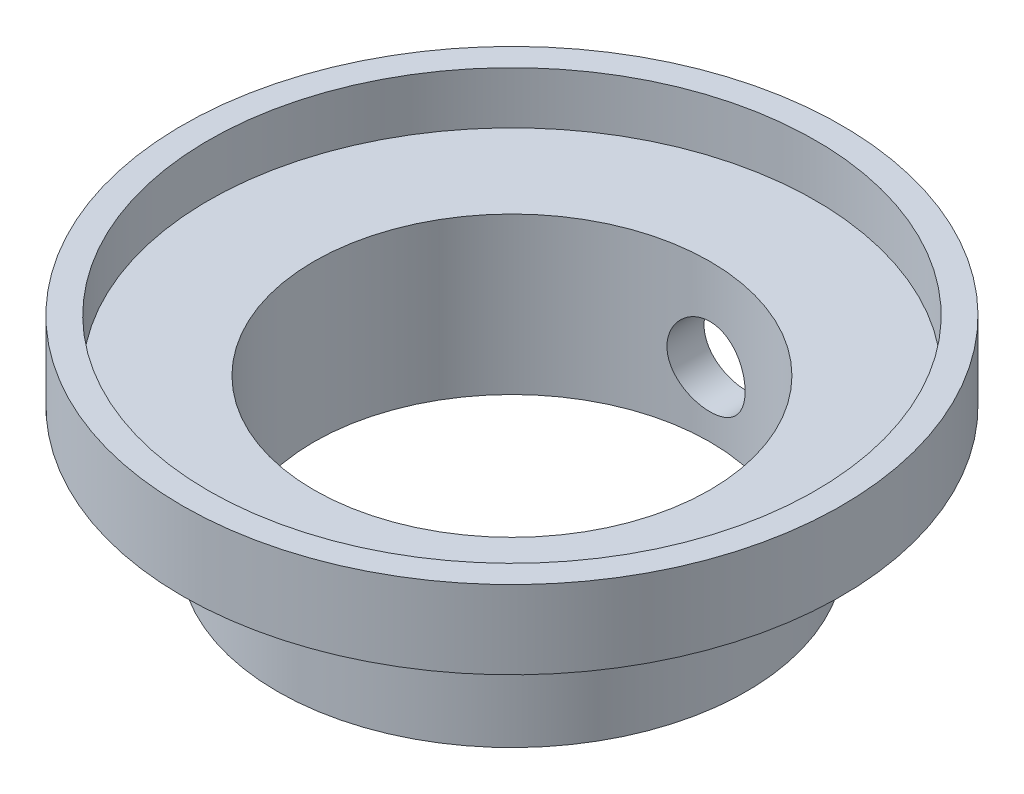
ISO-10303-21;
HEADER;
FILE_DESCRIPTION(('STEP AP214'),'2;1');
FILE_NAME('part.step','',(''),(''),'','','');
FILE_SCHEMA(('AUTOMOTIVE_DESIGN { 1 0 10303 214 1 1 1 1 }'));
ENDSEC;
DATA;
#1=APPLICATION_CONTEXT('core data for automotive mechanical design processes');
#2=APPLICATION_PROTOCOL_DEFINITION('international standard','automotive_design',2000,#1);
#3=PRODUCT_CONTEXT('',#1,'mechanical');
#4=PRODUCT('Part','Part','',(#3));
#5=PRODUCT_RELATED_PRODUCT_CATEGORY('part','',(#4));
#6=PRODUCT_DEFINITION_FORMATION('','',#4);
#7=PRODUCT_DEFINITION_CONTEXT('part definition',#1,'design');
#8=PRODUCT_DEFINITION('design','',#6,#7);
#9=PRODUCT_DEFINITION_SHAPE('','',#8);
#10=(LENGTH_UNIT() NAMED_UNIT(*) SI_UNIT(.MILLI.,.METRE.));
#11=(NAMED_UNIT(*) PLANE_ANGLE_UNIT() SI_UNIT($,.RADIAN.));
#12=(NAMED_UNIT(*) SI_UNIT($,.STERADIAN.) SOLID_ANGLE_UNIT());
#13=UNCERTAINTY_MEASURE_WITH_UNIT(LENGTH_MEASURE(1.E-05),#10,'distance_accuracy_value','');
#14=(GEOMETRIC_REPRESENTATION_CONTEXT(3) GLOBAL_UNCERTAINTY_ASSIGNED_CONTEXT((#13)) GLOBAL_UNIT_ASSIGNED_CONTEXT((#10,
#11,#12)) REPRESENTATION_CONTEXT('',''));
#15=CARTESIAN_POINT('',(0.,0.,0.));
#16=DIRECTION('',(0.,0.,1.));
#17=DIRECTION('',(1.,0.,0.));
#18=AXIS2_PLACEMENT_3D('',#15,#16,#17);
#19=CARTESIAN_POINT('',(0.,5.,0.));
#20=DIRECTION('',(0.,-1.,0.));
#21=DIRECTION('',(0.,0.,-1.));
#22=AXIS2_PLACEMENT_3D('',#19,#20,#21);
#23=CYLINDRICAL_SURFACE('',#22,7.6);
#24=CARTESIAN_POINT('',(0.,4.,-7.6));
#25=CARTESIAN_POINT('',(-0.0833882954260983,3.99999690568203,-7.59999846731646));
#26=CARTESIAN_POINT('',(-0.16681595080041,3.99302289688531,-7.59861347336578));
#27=CARTESIAN_POINT('',(-0.331314660751745,3.96533237390495,-7.59322202864026));
#28=CARTESIAN_POINT('',(-0.412383763062962,3.94460479524537,-7.58921346729257));
#29=CARTESIAN_POINT('',(-0.569763069772122,3.89007113109502,-7.57902267273425));
#30=CARTESIAN_POINT('',(-0.646077697407665,3.85627741896236,-7.57284249650143));
#31=CARTESIAN_POINT('',(-0.791948260339939,3.7766071862987,-7.55898096744683));
#32=CARTESIAN_POINT('',(-0.8615046287321,3.73073144073124,-7.55129971091522));
#33=CARTESIAN_POINT('',(-0.992808425317605,3.62755693254237,-7.53516852567));
#34=CARTESIAN_POINT('',(-1.05445373642969,3.57012945262946,-7.5267105783628));
#35=CARTESIAN_POINT('',(-1.16730148821099,3.4457583720991,-7.51003786426471));
#36=CARTESIAN_POINT('',(-1.21850312777628,3.37881404213939,-7.50182311617022));
#37=CARTESIAN_POINT('',(-1.30944262659768,3.2365777964665,-7.48648868213781));
#38=CARTESIAN_POINT('',(-1.34907514881321,3.1612173217938,-7.47937931809867));
#39=CARTESIAN_POINT('',(-1.41507667243237,3.00474353065807,-7.46717428861888));
#40=CARTESIAN_POINT('',(-1.44144694794969,2.92363076767617,-7.46207842974941));
#41=CARTESIAN_POINT('',(-1.47984472334415,2.7590522880349,-7.45455842094374));
#42=CARTESIAN_POINT('',(-1.49205115821018,2.6756298711449,-7.45210096977427));
#43=CARTESIAN_POINT('',(-1.5023304619897,2.50788773805616,-7.45003574737171));
#44=CARTESIAN_POINT('',(-1.50040473755417,2.42356811199577,-7.45042769252261));
#45=CARTESIAN_POINT('',(-1.48261914878387,2.2577314501898,-7.45398670792618));
#46=CARTESIAN_POINT('',(-1.46696405066031,2.17619144823763,-7.45711299510332));
#47=CARTESIAN_POINT('',(-1.42248716134059,2.01691841453156,-7.46572425876888));
#48=CARTESIAN_POINT('',(-1.39366475621043,1.93918556047546,-7.47120934523709));
#49=CARTESIAN_POINT('',(-1.32347487518395,1.78914131772466,-7.48396207443636));
#50=CARTESIAN_POINT('',(-1.28202591053328,1.71686906854432,-7.49124123562805));
#51=CARTESIAN_POINT('',(-1.18781701987153,1.58022873241671,-7.50675449384545));
#52=CARTESIAN_POINT('',(-1.13505582659404,1.51586153231404,-7.51498869781352));
#53=CARTESIAN_POINT('',(-1.01862217733036,1.39567656188384,-7.53166115587321));
#54=CARTESIAN_POINT('',(-0.95477487380354,1.3400281888219,-7.54010045857306));
#55=CARTESIAN_POINT('',(-0.818563301546584,1.24020493896749,-7.55610011368138));
#56=CARTESIAN_POINT('',(-0.746198929005114,1.19603020204387,-7.56366045537429));
#57=CARTESIAN_POINT('',(-0.594821684292629,1.12037822561605,-7.57706818317075));
#58=CARTESIAN_POINT('',(-0.515799081363791,1.08891997383981,-7.58291300419203));
#59=CARTESIAN_POINT('',(-0.353449644093562,1.03977254458351,-7.59221159681854));
#60=CARTESIAN_POINT('',(-0.270123318512191,1.02208174355345,-7.59566565035377));
#61=CARTESIAN_POINT('',(-0.102987822670782,1.0012103476005,-7.59975438236712));
#62=CARTESIAN_POINT('',(-0.0192086768965953,0.997797870631168,-7.60043411176403));
#63=CARTESIAN_POINT('',(0.147722781639433,1.00495603921252,-7.59902259316334));
#64=CARTESIAN_POINT('',(0.230875128426194,1.01552592017214,-7.59693149668157));
#65=CARTESIAN_POINT('',(0.393447241536413,1.05015608641561,-7.59024144613246));
#66=CARTESIAN_POINT('',(0.472893263908822,1.07409774751721,-7.58566455384801));
#67=CARTESIAN_POINT('',(0.62664330092132,1.13466250233559,-7.57451418337739));
#68=CARTESIAN_POINT('',(0.700946937407159,1.17128652748556,-7.56794055854917));
#69=CARTESIAN_POINT('',(0.843283449644109,1.25668052361383,-7.55341365928545));
#70=CARTESIAN_POINT('',(0.91123067852546,1.30559054943502,-7.54544482149564));
#71=CARTESIAN_POINT('',(1.03803649090538,1.4139802141129,-7.52904878544796));
#72=CARTESIAN_POINT('',(1.09689412604163,1.47346095447399,-7.52062153948595));
#73=CARTESIAN_POINT('',(1.20474196965242,1.60235797955403,-7.5041071483421));
#74=CARTESIAN_POINT('',(1.25357318872571,1.67190832342883,-7.49602688556772));
#75=CARTESIAN_POINT('',(1.33886037156818,1.81836049667803,-7.48126553466691));
#76=CARTESIAN_POINT('',(1.37531682351243,1.89526203589999,-7.47458439135027));
#77=CARTESIAN_POINT('',(1.43460073473362,2.05385094926967,-7.46343298965883));
#78=CARTESIAN_POINT('',(1.45749786163772,2.13551144926044,-7.45895145046849));
#79=CARTESIAN_POINT('',(1.4892252543612,2.30161833644466,-7.4526823600342));
#80=CARTESIAN_POINT('',(1.49805730061784,2.38606436964802,-7.45089446781476));
#81=CARTESIAN_POINT('',(1.50133928073934,2.5537497522602,-7.45023368379837));
#82=CARTESIAN_POINT('',(1.49604034648454,2.63698408788289,-7.45130989131229));
#83=CARTESIAN_POINT('',(1.47176408075177,2.80135012442833,-7.45614250333681));
#84=CARTESIAN_POINT('',(1.45278685283432,2.88248184126553,-7.45989888755535));
#85=CARTESIAN_POINT('',(1.40180342852674,3.04018513890953,-7.46964612749199));
#86=CARTESIAN_POINT('',(1.36982725324188,3.11676676418556,-7.4756318319363));
#87=CARTESIAN_POINT('',(1.2937821421052,3.26351762291104,-7.48916636236456));
#88=CARTESIAN_POINT('',(1.24971222621703,3.33368633606495,-7.49671531501676));
#89=CARTESIAN_POINT('',(1.1498695688623,3.46687165323727,-7.51268199677539));
#90=CARTESIAN_POINT('',(1.09391516013953,3.52975061833971,-7.52111203985961));
#91=CARTESIAN_POINT('',(0.972267748268353,3.64530988408945,-7.53780187135944));
#92=CARTESIAN_POINT('',(0.906572510743165,3.69798783839216,-7.54606162021606));
#93=CARTESIAN_POINT('',(0.766507935165378,3.79215323549242,-7.5615789045873));
#94=CARTESIAN_POINT('',(0.69205736675514,3.83352174052282,-7.56882542365656));
#95=CARTESIAN_POINT('',(0.537139996315096,3.90309548912266,-7.58139153478262));
#96=CARTESIAN_POINT('',(0.456678744112609,3.93131270551537,-7.5867128785113));
#97=CARTESIAN_POINT('',(0.313353711133121,3.96826081196191,-7.59378422734988));
#98=CARTESIAN_POINT('',(0.25131073766699,3.98014197828515,-7.59610160464355));
#99=CARTESIAN_POINT('',(0.126186001843747,3.99601262315547,-7.59921004769734));
#100=CARTESIAN_POINT('',(0.0631042711274969,4.00000234163175,-7.60000115986155));
#101=CARTESIAN_POINT('',(0.,4.,-7.6));
#102=B_SPLINE_CURVE_WITH_KNOTS('',3,(#24,#25,#26,#27,#28,#29,#30,#31,#32,#33,#34,#35,#36,#37,
#38,#39,#40,#41,#42,#43,#44,#45,#46,#47,#48,#49,#50,#51,#52,#53,#54,#55,#56,#57,#58,#59,#60,#61,
#62,#63,#64,#65,#66,#67,#68,#69,#70,#71,#72,#73,#74,#75,#76,#77,#78,#79,#80,#81,#82,#83,#84,#85,
#86,#87,#88,#89,#90,#91,#92,#93,#94,#95,#96,#97,#98,#99,#100,#101),.UNSPECIFIED.,.T.,.F.,(4,2,2,
2,2,2,2,2,2,2,2,2,2,2,2,2,2,2,2,2,2,2,2,2,2,2,2,2,2,2,2,2,2,2,2,2,2,2,4),(0.,0.249934048903834,
0.500069408996305,0.74996847395227,0.999851513831067,1.2526907488705,1.50554937119113,
1.76064318277515,2.01571248262733,2.26752309162421,2.51930863687617,2.76740160495061,
3.01550614169698,3.26524708317318,3.51501601681917,3.76915752040533,4.0233021219469,
4.27782481225775,4.53231748299816,4.78266071852692,5.03299026521365,5.28113356743093,
5.52929509794908,5.78042525891372,6.0315816038554,6.28645634575638,6.54132103187538,
6.79486460227273,7.04837607514282,7.2974123682363,7.5464467758565,7.79490927605594,
8.04339191677569,8.29598831213913,8.54864273861896,8.80386010434105,9.05884466625669,
9.24798854372353,9.4371266704286),.UNSPECIFIED.);
#103=CARTESIAN_POINT('',(0.,4.,-7.6));
#104=VERTEX_POINT('',#103);
#105=EDGE_CURVE('E73',#104,#104,#102,.T.);
#106=ORIENTED_EDGE('',*,*,#105,.F.);
#107=EDGE_LOOP('',(#106));
#108=FACE_BOUND('',#107,.T.);
#109=CARTESIAN_POINT('',(0.,0.,0.));
#110=DIRECTION('',(0.,1.,0.));
#111=DIRECTION('',(0.,0.,1.));
#112=AXIS2_PLACEMENT_3D('',#109,#110,#111);
#113=CIRCLE('',#112,7.6);
#114=CARTESIAN_POINT('',(0.,0.,7.6));
#115=VERTEX_POINT('',#114);
#116=EDGE_CURVE('E55',#115,#115,#113,.T.);
#117=ORIENTED_EDGE('',*,*,#116,.F.);
#118=EDGE_LOOP('',(#117));
#119=FACE_BOUND('',#118,.T.);
#120=CARTESIAN_POINT('',(0.,6.,0.));
#121=DIRECTION('',(0.,1.,0.));
#122=DIRECTION('',(0.,0.,1.));
#123=AXIS2_PLACEMENT_3D('',#120,#121,#122);
#124=CIRCLE('',#123,7.6);
#125=CARTESIAN_POINT('',(0.,6.,7.6));
#126=VERTEX_POINT('',#125);
#127=EDGE_CURVE('E59',#126,#126,#124,.T.);
#128=ORIENTED_EDGE('',*,*,#127,.T.);
#129=EDGE_LOOP('',(#128));
#130=FACE_BOUND('',#129,.T.);
#131=ADVANCED_FACE('F37',(#108,#119,#130),#23,.F.);
#132=CARTESIAN_POINT('',(0.,0.,0.));
#133=DIRECTION('',(0.,1.,0.));
#134=DIRECTION('',(0.,0.,1.));
#135=AXIS2_PLACEMENT_3D('',#132,#133,#134);
#136=PLANE('',#135);
#137=CARTESIAN_POINT('',(0.,0.,0.));
#138=DIRECTION('',(0.,1.,0.));
#139=DIRECTION('',(0.,0.,1.));
#140=AXIS2_PLACEMENT_3D('',#137,#138,#139);
#141=CIRCLE('',#140,8.99999999999999);
#142=CARTESIAN_POINT('',(0.,0.,8.99999999999999));
#143=VERTEX_POINT('',#142);
#144=EDGE_CURVE('E50',#143,#143,#141,.T.);
#145=ORIENTED_EDGE('',*,*,#144,.F.);
#146=EDGE_LOOP('',(#145));
#147=FACE_BOUND('',#146,.T.);
#148=ORIENTED_EDGE('',*,*,#116,.T.);
#149=EDGE_LOOP('',(#148));
#150=FACE_BOUND('',#149,.T.);
#151=ADVANCED_FACE('F87',(#147,#150),#136,.F.);
#152=CARTESIAN_POINT('',(0.,5.,0.));
#153=DIRECTION('',(0.,-1.,0.));
#154=DIRECTION('',(0.,0.,-1.));
#155=AXIS2_PLACEMENT_3D('',#152,#153,#154);
#156=CYLINDRICAL_SURFACE('',#155,8.99999999999999);
#157=CARTESIAN_POINT('',(0.,4.,-8.99999999999999));
#158=CARTESIAN_POINT('',(-0.0836345429749289,3.99999664663131,-8.99999856701294));
#159=CARTESIAN_POINT('',(-0.167314729103293,3.99298163501865,-8.9988220674782));
#160=CARTESIAN_POINT('',(-0.332328133003826,3.96511860474081,-8.99424206964832));
#161=CARTESIAN_POINT('',(-0.413659120775548,3.94425786585304,-8.99083652354333));
#162=CARTESIAN_POINT('',(-0.571562848327587,3.88935073084435,-8.98218040941869));
#163=CARTESIAN_POINT('',(-0.648139421059141,3.85531512061566,-8.97693135095515));
#164=CARTESIAN_POINT('',(-0.794485105186767,3.77505262476856,-8.96516536249242));
#165=CARTESIAN_POINT('',(-0.864254993927155,3.7288271335102,-8.9586485775266));
#166=CARTESIAN_POINT('',(-0.995683568575008,3.62502694970772,-8.94499990474987));
#167=CARTESIAN_POINT('',(-1.05726774212098,3.56735853121832,-8.93786323088913));
#168=CARTESIAN_POINT('',(-1.16993309919596,3.44251121891631,-8.92381576126039));
#169=CARTESIAN_POINT('',(-1.22101361963458,3.37533172512603,-8.916904979776));
#170=CARTESIAN_POINT('',(-1.31152027536308,3.23285742028177,-8.90404539455868));
#171=CARTESIAN_POINT('',(-1.3508727317166,3.15751519791715,-8.89810277454981));
#172=CARTESIAN_POINT('',(-1.41633501924673,3.00117426141962,-8.88791873876804));
#173=CARTESIAN_POINT('',(-1.44244574493937,2.92017592979342,-8.88367720808584));
#174=CARTESIAN_POINT('',(-1.48044862667088,2.75561183508608,-8.87742322105653));
#175=CARTESIAN_POINT('',(-1.49246941748124,2.67207655809917,-8.87539061091419));
#176=CARTESIAN_POINT('',(-1.50235003517393,2.50415183386992,-8.87372363361989));
#177=CARTESIAN_POINT('',(-1.5002108642334,2.41976244749962,-8.87408909674328));
#178=CARTESIAN_POINT('',(-1.48193705903769,2.25344328323473,-8.87715857318132));
#179=CARTESIAN_POINT('',(-1.46594692913386,2.17149711787286,-8.87983843991349));
#180=CARTESIAN_POINT('',(-1.42065188424207,2.01146720930252,-8.88719697126604));
#181=CARTESIAN_POINT('',(-1.39134651259184,1.93338359866687,-8.89187570443962));
#182=CARTESIAN_POINT('',(-1.32010634765635,1.78286270593545,-8.90273087600459));
#183=CARTESIAN_POINT('',(-1.27811154832783,1.71045435635126,-8.90891440264395));
#184=CARTESIAN_POINT('',(-1.18272721053446,1.57365735967697,-8.92207751049005));
#185=CARTESIAN_POINT('',(-1.12933675239257,1.50926936052704,-8.92905715592571));
#186=CARTESIAN_POINT('',(-1.01188932729543,1.38950434851559,-8.94313216727871));
#187=CARTESIAN_POINT('',(-0.947708378323876,1.33424888887595,-8.95022789538991));
#188=CARTESIAN_POINT('',(-0.810921149388988,1.2352733424008,-8.96365560838034));
#189=CARTESIAN_POINT('',(-0.738314815143853,1.19155332989006,-8.96998758833847));
#190=CARTESIAN_POINT('',(-0.586623549700026,1.11687866371823,-8.98118335735746));
#191=CARTESIAN_POINT('',(-0.507533235338796,1.08593474840125,-8.98604591044468));
#192=CARTESIAN_POINT('',(-0.345179007361638,1.03780347085241,-8.99374501807595));
#193=CARTESIAN_POINT('',(-0.26191544350768,1.02061495781577,-8.99658174210284));
#194=CARTESIAN_POINT('',(-0.0946259407809738,1.00064718492332,-8.99988677905611));
#195=CARTESIAN_POINT('',(-0.0106204422906065,0.997701056916636,-9.0003825180767));
#196=CARTESIAN_POINT('',(0.156683863733933,1.00585680665687,-8.99902484652702));
#197=CARTESIAN_POINT('',(0.239982698335224,1.01695814388024,-8.9971715263447));
#198=CARTESIAN_POINT('',(0.402993705328059,1.05275490960129,-8.99134096162921));
#199=CARTESIAN_POINT('',(0.482724521031228,1.07736772503408,-8.98737662880786));
#200=CARTESIAN_POINT('',(0.636928130916266,1.13940071091972,-8.97776678673215));
#201=CARTESIAN_POINT('',(0.711400629545832,1.17682160058116,-8.97212118307211));
#202=CARTESIAN_POINT('',(0.853698413681375,1.26379067481807,-8.95970709781444));
#203=CARTESIAN_POINT('',(0.921459150562289,1.31344309370035,-8.95292913532213));
#204=CARTESIAN_POINT('',(1.04774615130161,1.42332238923104,-8.9390308043514));
#205=CARTESIAN_POINT('',(1.10627174381795,1.483550033966,-8.93191041102927));
#206=CARTESIAN_POINT('',(1.2130456677948,1.61361852884285,-8.91804105141507));
#207=CARTESIAN_POINT('',(1.26118125666823,1.68355249930865,-8.91129669682263));
#208=CARTESIAN_POINT('',(1.34502138617699,1.83061178148312,-8.8990291786673));
#209=CARTESIAN_POINT('',(1.38072632086189,1.9077368651365,-8.89350597639612));
#210=CARTESIAN_POINT('',(1.43852299888389,2.06667383968728,-8.88434072218622));
#211=CARTESIAN_POINT('',(1.46067085952877,2.14846485701829,-8.88069092586638));
#212=CARTESIAN_POINT('',(1.49090127226697,2.31467207753306,-8.87566630101156));
#213=CARTESIAN_POINT('',(1.4989850471677,2.39908805183923,-8.87429127469632));
#214=CARTESIAN_POINT('',(1.50082371962841,2.56702309957745,-8.87398039850406));
#215=CARTESIAN_POINT('',(1.49475608167511,2.65054022714517,-8.87501433903389));
#216=CARTESIAN_POINT('',(1.46884790337411,2.81534754883046,-8.87933868872236));
#217=CARTESIAN_POINT('',(1.44900740766749,2.89663775016512,-8.88262909056728));
#218=CARTESIAN_POINT('',(1.39618469375694,3.05461506237557,-8.89108413769031));
#219=CARTESIAN_POINT('',(1.36321775436027,3.13130740603361,-8.89624660331801));
#220=CARTESIAN_POINT('',(1.28509620234955,3.27810140151691,-8.90786621353324));
#221=CARTESIAN_POINT('',(1.23994098524914,3.34820272622328,-8.91432342233039));
#222=CARTESIAN_POINT('',(1.13809133062329,3.48072134986465,-8.92790072427372));
#223=CARTESIAN_POINT('',(1.08126633815619,3.54303761002016,-8.93502777345781));
#224=CARTESIAN_POINT('',(0.957965418828138,3.65731096268496,-8.94908623416504));
#225=CARTESIAN_POINT('',(0.891487267747582,3.7092656611829,-8.95601760015927));
#226=CARTESIAN_POINT('',(0.750221501784168,3.80166896091997,-8.96895917785332));
#227=CARTESIAN_POINT('',(0.67537967251969,3.84203562358777,-8.97496269751862));
#228=CARTESIAN_POINT('',(0.519907841627388,3.90956169076595,-8.98530700561065));
#229=CARTESIAN_POINT('',(0.439283696898005,3.93673424864782,-8.98964944906488));
#230=CARTESIAN_POINT('',(0.29862198602724,3.971203164476,-8.99523474499773));
#231=CARTESIAN_POINT('',(0.239435298179068,3.98198468176958,-8.99701216364014));
#232=CARTESIAN_POINT('',(0.120173586191886,3.99638424270685,-8.99939529591672));
#233=CARTESIAN_POINT('',(0.0600985773650966,4.00000240968242,-9.00000102972384));
#234=CARTESIAN_POINT('',(0.,4.,-8.99999999999999));
#235=B_SPLINE_CURVE_WITH_KNOTS('',3,(#157,#158,#159,#160,#161,#162,#163,#164,#165,#166,#167,
#168,#169,#170,#171,#172,#173,#174,#175,#176,#177,#178,#179,#180,#181,#182,#183,#184,#185,#186,
#187,#188,#189,#190,#191,#192,#193,#194,#195,#196,#197,#198,#199,#200,#201,#202,#203,#204,#205,
#206,#207,#208,#209,#210,#211,#212,#213,#214,#215,#216,#217,#218,#219,#220,#221,#222,#223,#224,
#225,#226,#227,#228,#229,#230,#231,#232,#233,#234),.UNSPECIFIED.,.T.,.F.,(4,2,2,2,2,2,2,2,2,2,2,
2,2,2,2,2,2,2,2,2,2,2,2,2,2,2,2,2,2,2,2,2,2,2,2,2,2,2,4),(0.,0.250683950963106,
0.501598527417252,0.752308120215162,1.00298904760487,1.25581494637399,1.50865680101914,
1.76305512494304,2.01743626125709,2.26947646262054,2.52149882592532,2.77092313056245,
3.02035599015229,3.27098733979535,3.52163892408344,3.77539661946796,4.02915594981509,
4.28312813349542,4.53707906712689,4.78804730094838,5.03900587821516,5.2884468420385,
5.5379018149564,5.78956095376214,6.0412383783257,6.29552293204572,6.54979942425566,
6.80301613405063,7.05621082671971,7.3062474571362,7.5562832771288,7.80602890935734,
8.05578693017602,8.30850830516035,8.56128800327383,8.8158133896432,9.07008451278043,
9.25022548898411,9.43036336366181),.UNSPECIFIED.);
#236=CARTESIAN_POINT('',(0.,4.,-8.99999999999999));
#237=VERTEX_POINT('',#236);
#238=EDGE_CURVE('E42',#237,#237,#235,.T.);
#239=ORIENTED_EDGE('',*,*,#238,.T.);
#240=EDGE_LOOP('',(#239));
#241=FACE_BOUND('',#240,.T.);
#242=CARTESIAN_POINT('',(0.,5.,0.));
#243=DIRECTION('',(0.,1.,0.));
#244=DIRECTION('',(0.,0.,1.));
#245=AXIS2_PLACEMENT_3D('',#242,#243,#244);
#246=CIRCLE('',#245,8.99999999999999);
#247=CARTESIAN_POINT('',(0.,5.,8.99999999999999));
#248=VERTEX_POINT('',#247);
#249=EDGE_CURVE('E10',#248,#248,#246,.T.);
#250=ORIENTED_EDGE('',*,*,#249,.F.);
#251=EDGE_LOOP('',(#250));
#252=FACE_BOUND('',#251,.T.);
#253=ORIENTED_EDGE('',*,*,#144,.T.);
#254=EDGE_LOOP('',(#253));
#255=FACE_BOUND('',#254,.T.);
#256=ADVANCED_FACE('F39',(#241,#252,#255),#156,.T.);
#257=CARTESIAN_POINT('',(0.,8.,0.));
#258=DIRECTION('',(0.,1.,0.));
#259=DIRECTION('',(0.,0.,1.));
#260=AXIS2_PLACEMENT_3D('',#257,#258,#259);
#261=PLANE('',#260);
#262=CARTESIAN_POINT('',(0.,8.,0.));
#263=DIRECTION('',(0.,1.,0.));
#264=DIRECTION('',(0.,0.,1.));
#265=AXIS2_PLACEMENT_3D('',#262,#263,#264);
#266=CIRCLE('',#265,11.65);
#267=CARTESIAN_POINT('',(0.,8.,11.65));
#268=VERTEX_POINT('',#267);
#269=EDGE_CURVE('E68',#268,#268,#266,.T.);
#270=ORIENTED_EDGE('',*,*,#269,.F.);
#271=EDGE_LOOP('',(#270));
#272=FACE_BOUND('',#271,.T.);
#273=CARTESIAN_POINT('',(0.,8.,0.));
#274=DIRECTION('',(0.,1.,0.));
#275=DIRECTION('',(0.,0.,1.));
#276=AXIS2_PLACEMENT_3D('',#273,#274,#275);
#277=CIRCLE('',#276,12.65);
#278=CARTESIAN_POINT('',(0.,8.,12.65));
#279=VERTEX_POINT('',#278);
#280=EDGE_CURVE('E66',#279,#279,#277,.T.);
#281=ORIENTED_EDGE('',*,*,#280,.T.);
#282=EDGE_LOOP('',(#281));
#283=FACE_BOUND('',#282,.T.);
#284=ADVANCED_FACE('F106',(#272,#283),#261,.T.);
#285=CARTESIAN_POINT('',(0.,5.,0.));
#286=DIRECTION('',(0.,1.,0.));
#287=DIRECTION('',(0.,0.,1.));
#288=AXIS2_PLACEMENT_3D('',#285,#286,#287);
#289=PLANE('',#288);
#290=ORIENTED_EDGE('',*,*,#249,.T.);
#291=EDGE_LOOP('',(#290));
#292=FACE_BOUND('',#291,.T.);
#293=CARTESIAN_POINT('',(0.,5.,0.));
#294=DIRECTION('',(0.,1.,0.));
#295=DIRECTION('',(0.,0.,1.));
#296=AXIS2_PLACEMENT_3D('',#293,#294,#295);
#297=CIRCLE('',#296,12.65);
#298=CARTESIAN_POINT('',(0.,5.,12.65));
#299=VERTEX_POINT('',#298);
#300=EDGE_CURVE('E61',#299,#299,#297,.T.);
#301=ORIENTED_EDGE('',*,*,#300,.F.);
#302=EDGE_LOOP('',(#301));
#303=FACE_BOUND('',#302,.T.);
#304=ADVANCED_FACE('F102',(#292,#303),#289,.F.);
#305=CARTESIAN_POINT('',(0.,8.,0.));
#306=DIRECTION('',(0.,-1.,0.));
#307=DIRECTION('',(0.,0.,-1.));
#308=AXIS2_PLACEMENT_3D('',#305,#306,#307);
#309=CYLINDRICAL_SURFACE('',#308,12.65);
#310=ORIENTED_EDGE('',*,*,#280,.F.);
#311=EDGE_LOOP('',(#310));
#312=FACE_BOUND('',#311,.T.);
#313=ORIENTED_EDGE('',*,*,#300,.T.);
#314=EDGE_LOOP('',(#313));
#315=FACE_BOUND('',#314,.T.);
#316=ADVANCED_FACE('F98',(#312,#315),#309,.T.);
#317=CARTESIAN_POINT('',(0.,6.,0.));
#318=DIRECTION('',(0.,1.,0.));
#319=DIRECTION('',(0.,0.,1.));
#320=AXIS2_PLACEMENT_3D('',#317,#318,#319);
#321=CYLINDRICAL_SURFACE('',#320,11.65);
#322=CARTESIAN_POINT('',(0.,6.,0.));
#323=DIRECTION('',(0.,1.,0.));
#324=DIRECTION('',(0.,0.,1.));
#325=AXIS2_PLACEMENT_3D('',#322,#323,#324);
#326=CIRCLE('',#325,11.65);
#327=CARTESIAN_POINT('',(0.,6.,11.65));
#328=VERTEX_POINT('',#327);
#329=EDGE_CURVE('E62',#328,#328,#326,.T.);
#330=ORIENTED_EDGE('',*,*,#329,.F.);
#331=EDGE_LOOP('',(#330));
#332=FACE_BOUND('',#331,.T.);
#333=ORIENTED_EDGE('',*,*,#269,.T.);
#334=EDGE_LOOP('',(#333));
#335=FACE_BOUND('',#334,.T.);
#336=ADVANCED_FACE('F101',(#332,#335),#321,.F.);
#337=CARTESIAN_POINT('',(0.,6.,0.));
#338=DIRECTION('',(0.,1.,0.));
#339=DIRECTION('',(0.,0.,1.));
#340=AXIS2_PLACEMENT_3D('',#337,#338,#339);
#341=PLANE('',#340);
#342=ORIENTED_EDGE('',*,*,#127,.F.);
#343=EDGE_LOOP('',(#342));
#344=FACE_BOUND('',#343,.T.);
#345=ORIENTED_EDGE('',*,*,#329,.T.);
#346=EDGE_LOOP('',(#345));
#347=FACE_BOUND('',#346,.T.);
#348=ADVANCED_FACE('F112',(#344,#347),#341,.T.);
#349=CARTESIAN_POINT('',(0.,2.5,-12.));
#350=DIRECTION('',(0.,0.,1.));
#351=DIRECTION('',(1.,0.,0.));
#352=AXIS2_PLACEMENT_3D('',#349,#350,#351);
#353=CYLINDRICAL_SURFACE('',#352,1.5);
#354=ORIENTED_EDGE('',*,*,#105,.T.);
#355=EDGE_LOOP('',(#354));
#356=FACE_BOUND('',#355,.T.);
#357=ORIENTED_EDGE('',*,*,#238,.F.);
#358=EDGE_LOOP('',(#357));
#359=FACE_BOUND('',#358,.T.);
#360=ADVANCED_FACE('F115',(#356,#359),#353,.F.);
#361=CLOSED_SHELL('',(#131,#151,#256,#284,#304,#316,#336,#348,#360));
#362=MANIFOLD_SOLID_BREP('B2',#361);
#363=ADVANCED_BREP_SHAPE_REPRESENTATION('',(#18,#362),#14);
#364=SHAPE_DEFINITION_REPRESENTATION(#9,#363);
ENDSEC;
END-ISO-10303-21;
